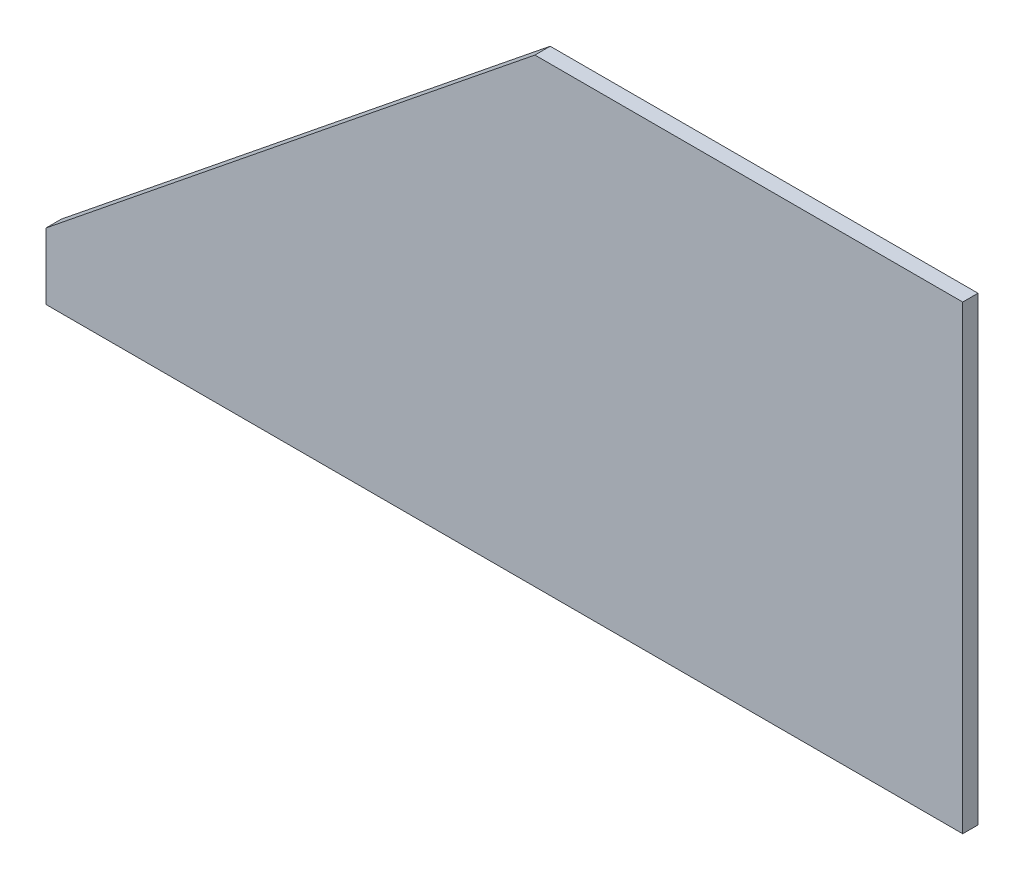
ISO-10303-21;
HEADER;
FILE_DESCRIPTION(('STEP AP214'),'2;1');
FILE_NAME('part.step','',(''),(''),'','','');
FILE_SCHEMA(('AUTOMOTIVE_DESIGN { 1 0 10303 214 1 1 1 1 }'));
ENDSEC;
DATA;
#1=APPLICATION_CONTEXT('core data for automotive mechanical design processes');
#2=APPLICATION_PROTOCOL_DEFINITION('international standard','automotive_design',2000,#1);
#3=PRODUCT_CONTEXT('',#1,'mechanical');
#4=PRODUCT('Part','Part','',(#3));
#5=PRODUCT_RELATED_PRODUCT_CATEGORY('part','',(#4));
#6=PRODUCT_DEFINITION_FORMATION('','',#4);
#7=PRODUCT_DEFINITION_CONTEXT('part definition',#1,'design');
#8=PRODUCT_DEFINITION('design','',#6,#7);
#9=PRODUCT_DEFINITION_SHAPE('','',#8);
#10=(LENGTH_UNIT() NAMED_UNIT(*) SI_UNIT(.MILLI.,.METRE.));
#11=(NAMED_UNIT(*) PLANE_ANGLE_UNIT() SI_UNIT($,.RADIAN.));
#12=(NAMED_UNIT(*) SI_UNIT($,.STERADIAN.) SOLID_ANGLE_UNIT());
#13=UNCERTAINTY_MEASURE_WITH_UNIT(LENGTH_MEASURE(1.E-05),#10,'distance_accuracy_value','');
#14=(GEOMETRIC_REPRESENTATION_CONTEXT(3) GLOBAL_UNCERTAINTY_ASSIGNED_CONTEXT((#13)) GLOBAL_UNIT_ASSIGNED_CONTEXT((#10,
#11,#12)) REPRESENTATION_CONTEXT('',''));
#15=CARTESIAN_POINT('',(0.,0.,0.));
#16=DIRECTION('',(0.,0.,1.));
#17=DIRECTION('',(1.,0.,0.));
#18=AXIS2_PLACEMENT_3D('',#15,#16,#17);
#19=CARTESIAN_POINT('',(0.,-27.559,6.35));
#20=DIRECTION('',(1.,0.,0.));
#21=DIRECTION('',(0.,0.,-1.));
#22=AXIS2_PLACEMENT_3D('',#19,#20,#21);
#23=PLANE('',#22);
#24=DIRECTION('',(0.,-1.,0.));
#25=VECTOR('',#24,1.);
#26=CARTESIAN_POINT('',(0.,-27.559,0.));
#27=LINE('',#26,#25);
#28=CARTESIAN_POINT('',(0.,0.,0.));
#29=VERTEX_POINT('',#28);
#30=CARTESIAN_POINT('',(0.,-27.559,0.));
#31=VERTEX_POINT('',#30);
#32=EDGE_CURVE('E120',#29,#31,#27,.T.);
#33=ORIENTED_EDGE('',*,*,#32,.T.);
#34=DIRECTION('',(0.,0.,-1.));
#35=VECTOR('',#34,1.);
#36=CARTESIAN_POINT('',(0.,-27.559,6.35));
#37=LINE('',#36,#35);
#38=CARTESIAN_POINT('',(0.,-27.559,6.35));
#39=VERTEX_POINT('',#38);
#40=EDGE_CURVE('E11',#39,#31,#37,.T.);
#41=ORIENTED_EDGE('',*,*,#40,.F.);
#42=DIRECTION('',(0.,-1.,0.));
#43=VECTOR('',#42,1.);
#44=CARTESIAN_POINT('',(0.,-27.559,6.35));
#45=LINE('',#44,#43);
#46=CARTESIAN_POINT('',(0.,0.,6.35));
#47=VERTEX_POINT('',#46);
#48=EDGE_CURVE('E133',#47,#39,#45,.T.);
#49=ORIENTED_EDGE('',*,*,#48,.F.);
#50=DIRECTION('',(0.,0.,-1.));
#51=VECTOR('',#50,1.);
#52=CARTESIAN_POINT('',(0.,0.,6.35));
#53=LINE('',#52,#51);
#54=EDGE_CURVE('E116',#47,#29,#53,.T.);
#55=ORIENTED_EDGE('',*,*,#54,.T.);
#56=EDGE_LOOP('',(#33,#41,#49,#55));
#57=FACE_BOUND('',#56,.T.);
#58=ADVANCED_FACE('F41',(#57),#23,.F.);
#59=CARTESIAN_POINT('',(381.,-27.559,6.35));
#60=DIRECTION('',(0.,1.,0.));
#61=DIRECTION('',(-1.,0.,0.));
#62=AXIS2_PLACEMENT_3D('',#59,#60,#61);
#63=PLANE('',#62);
#64=DIRECTION('',(1.,0.,0.));
#65=VECTOR('',#64,1.);
#66=CARTESIAN_POINT('',(381.,-27.559,0.));
#67=LINE('',#66,#65);
#68=CARTESIAN_POINT('',(381.,-27.559,0.));
#69=VERTEX_POINT('',#68);
#70=EDGE_CURVE('E124',#31,#69,#67,.T.);
#71=ORIENTED_EDGE('',*,*,#70,.T.);
#72=DIRECTION('',(0.,0.,-1.));
#73=VECTOR('',#72,1.);
#74=CARTESIAN_POINT('',(381.,-27.559,6.35));
#75=LINE('',#74,#73);
#76=CARTESIAN_POINT('',(381.,-27.559,6.35));
#77=VERTEX_POINT('',#76);
#78=EDGE_CURVE('E50',#77,#69,#75,.T.);
#79=ORIENTED_EDGE('',*,*,#78,.F.);
#80=DIRECTION('',(1.,0.,0.));
#81=VECTOR('',#80,1.);
#82=CARTESIAN_POINT('',(381.,-27.559,6.35));
#83=LINE('',#82,#81);
#84=EDGE_CURVE('E92',#39,#77,#83,.T.);
#85=ORIENTED_EDGE('',*,*,#84,.F.);
#86=ORIENTED_EDGE('',*,*,#40,.T.);
#87=EDGE_LOOP('',(#71,#79,#85,#86));
#88=FACE_BOUND('',#87,.T.);
#89=ADVANCED_FACE('F155',(#88),#63,.F.);
#90=CARTESIAN_POINT('',(381.,163.83,6.35));
#91=DIRECTION('',(-1.,0.,0.));
#92=DIRECTION('',(0.,0.,1.));
#93=AXIS2_PLACEMENT_3D('',#90,#91,#92);
#94=PLANE('',#93);
#95=DIRECTION('',(0.,1.,0.));
#96=VECTOR('',#95,1.);
#97=CARTESIAN_POINT('',(381.,163.83,0.));
#98=LINE('',#97,#96);
#99=CARTESIAN_POINT('',(381.,163.83,0.));
#100=VERTEX_POINT('',#99);
#101=EDGE_CURVE('E108',#69,#100,#98,.T.);
#102=ORIENTED_EDGE('',*,*,#101,.T.);
#103=DIRECTION('',(0.,0.,-1.));
#104=VECTOR('',#103,1.);
#105=CARTESIAN_POINT('',(381.,163.83,6.35));
#106=LINE('',#105,#104);
#107=CARTESIAN_POINT('',(381.,163.83,6.35));
#108=VERTEX_POINT('',#107);
#109=EDGE_CURVE('E105',#108,#100,#106,.T.);
#110=ORIENTED_EDGE('',*,*,#109,.F.);
#111=DIRECTION('',(0.,1.,0.));
#112=VECTOR('',#111,1.);
#113=CARTESIAN_POINT('',(381.,163.83,6.35));
#114=LINE('',#113,#112);
#115=EDGE_CURVE('E96',#77,#108,#114,.T.);
#116=ORIENTED_EDGE('',*,*,#115,.F.);
#117=ORIENTED_EDGE('',*,*,#78,.T.);
#118=EDGE_LOOP('',(#102,#110,#116,#117));
#119=FACE_BOUND('',#118,.T.);
#120=ADVANCED_FACE('F106',(#119),#94,.F.);
#121=CARTESIAN_POINT('',(203.2,163.83,6.35));
#122=DIRECTION('',(0.,-1.,0.));
#123=DIRECTION('',(0.,0.,-1.));
#124=AXIS2_PLACEMENT_3D('',#121,#122,#123);
#125=PLANE('',#124);
#126=DIRECTION('',(-1.,0.,0.));
#127=VECTOR('',#126,1.);
#128=CARTESIAN_POINT('',(203.2,163.83,0.));
#129=LINE('',#128,#127);
#130=CARTESIAN_POINT('',(203.2,163.83,0.));
#131=VERTEX_POINT('',#130);
#132=EDGE_CURVE('E78',#100,#131,#129,.T.);
#133=ORIENTED_EDGE('',*,*,#132,.T.);
#134=DIRECTION('',(0.,0.,-1.));
#135=VECTOR('',#134,1.);
#136=CARTESIAN_POINT('',(203.2,163.83,6.35));
#137=LINE('',#136,#135);
#138=CARTESIAN_POINT('',(203.2,163.83,6.35));
#139=VERTEX_POINT('',#138);
#140=EDGE_CURVE('E110',#139,#131,#137,.T.);
#141=ORIENTED_EDGE('',*,*,#140,.F.);
#142=DIRECTION('',(-1.,0.,0.));
#143=VECTOR('',#142,1.);
#144=CARTESIAN_POINT('',(203.2,163.83,6.35));
#145=LINE('',#144,#143);
#146=EDGE_CURVE('E100',#108,#139,#145,.T.);
#147=ORIENTED_EDGE('',*,*,#146,.F.);
#148=ORIENTED_EDGE('',*,*,#109,.T.);
#149=EDGE_LOOP('',(#133,#141,#147,#148));
#150=FACE_BOUND('',#149,.T.);
#151=ADVANCED_FACE('F112',(#150),#125,.F.);
#152=CARTESIAN_POINT('',(0.,0.,6.35));
#153=DIRECTION('',(0.627657344118138,-0.778489729138776,0.));
#154=DIRECTION('',(0.778489729138776,0.627657344118138,0.));
#155=AXIS2_PLACEMENT_3D('',#152,#153,#154);
#156=PLANE('',#155);
#157=DIRECTION('',(-0.778489729138776,-0.627657344118138,0.));
#158=VECTOR('',#157,1.);
#159=CARTESIAN_POINT('',(0.,0.,0.));
#160=LINE('',#159,#158);
#161=EDGE_CURVE('E84',#131,#29,#160,.T.);
#162=ORIENTED_EDGE('',*,*,#161,.T.);
#163=ORIENTED_EDGE('',*,*,#54,.F.);
#164=DIRECTION('',(-0.778489729138776,-0.627657344118138,0.));
#165=VECTOR('',#164,1.);
#166=CARTESIAN_POINT('',(0.,0.,6.35));
#167=LINE('',#166,#165);
#168=EDGE_CURVE('E58',#139,#47,#167,.T.);
#169=ORIENTED_EDGE('',*,*,#168,.F.);
#170=ORIENTED_EDGE('',*,*,#140,.T.);
#171=EDGE_LOOP('',(#162,#163,#169,#170));
#172=FACE_BOUND('',#171,.T.);
#173=ADVANCED_FACE('F144',(#172),#156,.F.);
#174=CARTESIAN_POINT('',(0.,0.,6.35));
#175=DIRECTION('',(0.,0.,-1.));
#176=DIRECTION('',(-1.,0.,0.));
#177=AXIS2_PLACEMENT_3D('',#174,#175,#176);
#178=PLANE('',#177);
#179=ORIENTED_EDGE('',*,*,#48,.T.);
#180=ORIENTED_EDGE('',*,*,#84,.T.);
#181=ORIENTED_EDGE('',*,*,#115,.T.);
#182=ORIENTED_EDGE('',*,*,#146,.T.);
#183=ORIENTED_EDGE('',*,*,#168,.T.);
#184=EDGE_LOOP('',(#179,#180,#181,#182,#183));
#185=FACE_BOUND('',#184,.T.);
#186=ADVANCED_FACE('F98',(#185),#178,.F.);
#187=CARTESIAN_POINT('',(0.,0.,0.));
#188=DIRECTION('',(0.,0.,-1.));
#189=DIRECTION('',(-1.,0.,0.));
#190=AXIS2_PLACEMENT_3D('',#187,#188,#189);
#191=PLANE('',#190);
#192=ORIENTED_EDGE('',*,*,#32,.F.);
#193=ORIENTED_EDGE('',*,*,#161,.F.);
#194=ORIENTED_EDGE('',*,*,#132,.F.);
#195=ORIENTED_EDGE('',*,*,#101,.F.);
#196=ORIENTED_EDGE('',*,*,#70,.F.);
#197=EDGE_LOOP('',(#192,#193,#194,#195,#196));
#198=FACE_BOUND('',#197,.T.);
#199=ADVANCED_FACE('F140',(#198),#191,.T.);
#200=CLOSED_SHELL('',(#58,#89,#120,#151,#173,#186,#199));
#201=MANIFOLD_SOLID_BREP('B2',#200);
#202=ADVANCED_BREP_SHAPE_REPRESENTATION('',(#18,#201),#14);
#203=SHAPE_DEFINITION_REPRESENTATION(#9,#202);
ENDSEC;
END-ISO-10303-21;
